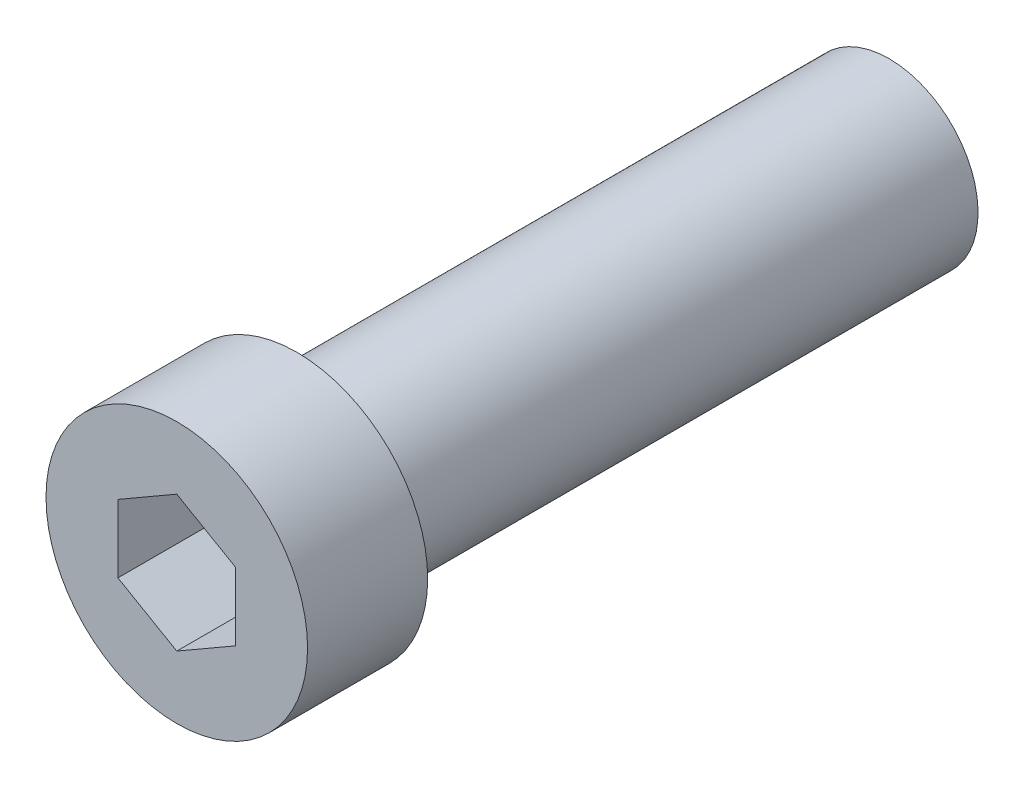
ISO-10303-21;
HEADER;
FILE_DESCRIPTION(('STEP AP214'),'2;1');
FILE_NAME('part.step','',(''),(''),'','','');
FILE_SCHEMA(('AUTOMOTIVE_DESIGN { 1 0 10303 214 1 1 1 1 }'));
ENDSEC;
DATA;
#1=APPLICATION_CONTEXT('core data for automotive mechanical design processes');
#2=APPLICATION_PROTOCOL_DEFINITION('international standard','automotive_design',2000,#1);
#3=PRODUCT_CONTEXT('',#1,'mechanical');
#4=PRODUCT('Part','Part','',(#3));
#5=PRODUCT_RELATED_PRODUCT_CATEGORY('part','',(#4));
#6=PRODUCT_DEFINITION_FORMATION('','',#4);
#7=PRODUCT_DEFINITION_CONTEXT('part definition',#1,'design');
#8=PRODUCT_DEFINITION('design','',#6,#7);
#9=PRODUCT_DEFINITION_SHAPE('','',#8);
#10=(LENGTH_UNIT() NAMED_UNIT(*) SI_UNIT(.MILLI.,.METRE.));
#11=(NAMED_UNIT(*) PLANE_ANGLE_UNIT() SI_UNIT($,.RADIAN.));
#12=(NAMED_UNIT(*) SI_UNIT($,.STERADIAN.) SOLID_ANGLE_UNIT());
#13=UNCERTAINTY_MEASURE_WITH_UNIT(LENGTH_MEASURE(1.E-05),#10,'distance_accuracy_value','');
#14=(GEOMETRIC_REPRESENTATION_CONTEXT(3) GLOBAL_UNCERTAINTY_ASSIGNED_CONTEXT((#13)) GLOBAL_UNIT_ASSIGNED_CONTEXT((#10,
#11,#12)) REPRESENTATION_CONTEXT('',''));
#15=CARTESIAN_POINT('',(0.,0.,0.));
#16=DIRECTION('',(0.,0.,1.));
#17=DIRECTION('',(1.,0.,0.));
#18=AXIS2_PLACEMENT_3D('',#15,#16,#17);
#19=CARTESIAN_POINT('',(0.,0.,2.028));
#20=DIRECTION('',(0.,0.,-1.));
#21=DIRECTION('',(0.,1.,0.));
#22=AXIS2_PLACEMENT_3D('',#19,#20,#21);
#23=CYLINDRICAL_SURFACE('',#22,2.208);
#24=CARTESIAN_POINT('',(0.,0.,2.028));
#25=DIRECTION('',(0.,0.,-1.));
#26=DIRECTION('',(0.,1.,0.));
#27=AXIS2_PLACEMENT_3D('',#24,#25,#26);
#28=CIRCLE('',#27,2.208);
#29=CARTESIAN_POINT('',(0.,2.208,2.028));
#30=VERTEX_POINT('',#29);
#31=EDGE_CURVE('E40',#30,#30,#28,.T.);
#32=ORIENTED_EDGE('',*,*,#31,.T.);
#33=EDGE_LOOP('',(#32));
#34=FACE_BOUND('',#33,.T.);
#35=CARTESIAN_POINT('',(0.,0.,0.));
#36=DIRECTION('',(0.,0.,-1.));
#37=DIRECTION('',(0.,1.,0.));
#38=AXIS2_PLACEMENT_3D('',#35,#36,#37);
#39=CIRCLE('',#38,2.208);
#40=CARTESIAN_POINT('',(0.,2.208,0.));
#41=VERTEX_POINT('',#40);
#42=EDGE_CURVE('E146',#41,#41,#39,.T.);
#43=ORIENTED_EDGE('',*,*,#42,.F.);
#44=EDGE_LOOP('',(#43));
#45=FACE_BOUND('',#44,.T.);
#46=ADVANCED_FACE('F37',(#34,#45),#23,.T.);
#47=CARTESIAN_POINT('',(2.208,0.,2.028));
#48=DIRECTION('',(0.,0.,1.));
#49=DIRECTION('',(0.,-1.,0.));
#50=AXIS2_PLACEMENT_3D('',#47,#48,#49);
#51=PLANE('',#50);
#52=DIRECTION('',(0.866025403784439,0.5,0.));
#53=VECTOR('',#52,1.);
#54=CARTESIAN_POINT('',(0.,-1.14731045493362,2.028));
#55=LINE('',#54,#53);
#56=CARTESIAN_POINT('',(0.,-1.14731045493362,2.028));
#57=VERTEX_POINT('',#56);
#58=CARTESIAN_POINT('',(0.9936,-0.573655227466812,2.028));
#59=VERTEX_POINT('',#58);
#60=EDGE_CURVE('E52',#57,#59,#55,.T.);
#61=ORIENTED_EDGE('',*,*,#60,.F.);
#62=DIRECTION('',(0.866025403784439,-0.5,0.));
#63=VECTOR('',#62,1.);
#64=CARTESIAN_POINT('',(-0.9936,-0.573655227466812,2.028));
#65=LINE('',#64,#63);
#66=CARTESIAN_POINT('',(-0.9936,-0.573655227466812,2.028));
#67=VERTEX_POINT('',#66);
#68=EDGE_CURVE('E135',#67,#57,#65,.T.);
#69=ORIENTED_EDGE('',*,*,#68,.F.);
#70=DIRECTION('',(0.,-1.,0.));
#71=VECTOR('',#70,1.);
#72=CARTESIAN_POINT('',(-0.9936,0.573655227466811,2.028));
#73=LINE('',#72,#71);
#74=CARTESIAN_POINT('',(-0.9936,0.573655227466811,2.028));
#75=VERTEX_POINT('',#74);
#76=EDGE_CURVE('E133',#75,#67,#73,.T.);
#77=ORIENTED_EDGE('',*,*,#76,.F.);
#78=DIRECTION('',(-0.866025403784438,-0.500000000000001,0.));
#79=VECTOR('',#78,1.);
#80=CARTESIAN_POINT('',(0.,1.14731045493362,2.028));
#81=LINE('',#80,#79);
#82=CARTESIAN_POINT('',(0.,1.14731045493362,2.028));
#83=VERTEX_POINT('',#82);
#84=EDGE_CURVE('E100',#83,#75,#81,.T.);
#85=ORIENTED_EDGE('',*,*,#84,.F.);
#86=DIRECTION('',(-0.866025403784438,0.500000000000001,0.));
#87=VECTOR('',#86,1.);
#88=CARTESIAN_POINT('',(0.9936,0.573655227466811,2.028));
#89=LINE('',#88,#87);
#90=CARTESIAN_POINT('',(0.9936,0.573655227466811,2.028));
#91=VERTEX_POINT('',#90);
#92=EDGE_CURVE('E129',#91,#83,#89,.T.);
#93=ORIENTED_EDGE('',*,*,#92,.F.);
#94=DIRECTION('',(0.,1.,0.));
#95=VECTOR('',#94,1.);
#96=CARTESIAN_POINT('',(0.9936,-0.573655227466812,2.028));
#97=LINE('',#96,#95);
#98=EDGE_CURVE('E126',#59,#91,#97,.T.);
#99=ORIENTED_EDGE('',*,*,#98,.F.);
#100=EDGE_LOOP('',(#61,#69,#77,#85,#93,#99));
#101=FACE_BOUND('',#100,.T.);
#102=ORIENTED_EDGE('',*,*,#31,.F.);
#103=EDGE_LOOP('',(#102));
#104=FACE_BOUND('',#103,.T.);
#105=ADVANCED_FACE('F155',(#101,#104),#51,.T.);
#106=CARTESIAN_POINT('',(0.,0.,0.));
#107=DIRECTION('',(0.,0.,-1.));
#108=DIRECTION('',(0.,1.,0.));
#109=AXIS2_PLACEMENT_3D('',#106,#107,#108);
#110=PLANE('',#109);
#111=CARTESIAN_POINT('',(0.,0.,0.));
#112=DIRECTION('',(0.,0.,-1.));
#113=DIRECTION('',(0.,1.,0.));
#114=AXIS2_PLACEMENT_3D('',#111,#112,#113);
#115=CIRCLE('',#114,1.50000000000006);
#116=CARTESIAN_POINT('',(0.,1.50000000000006,0.));
#117=VERTEX_POINT('',#116);
#118=EDGE_CURVE('E11',#117,#117,#115,.T.);
#119=ORIENTED_EDGE('',*,*,#118,.F.);
#120=EDGE_LOOP('',(#119));
#121=FACE_BOUND('',#120,.T.);
#122=ORIENTED_EDGE('',*,*,#42,.T.);
#123=EDGE_LOOP('',(#122));
#124=FACE_BOUND('',#123,.T.);
#125=ADVANCED_FACE('F157',(#121,#124),#110,.T.);
#126=CARTESIAN_POINT('',(0.,0.,-10.));
#127=DIRECTION('',(0.,0.,1.));
#128=DIRECTION('',(0.,-1.,0.));
#129=AXIS2_PLACEMENT_3D('',#126,#127,#128);
#130=CYLINDRICAL_SURFACE('',#129,1.50000000000006);
#131=CARTESIAN_POINT('',(0.,0.,-10.));
#132=DIRECTION('',(0.,0.,-1.));
#133=DIRECTION('',(0.,1.,0.));
#134=AXIS2_PLACEMENT_3D('',#131,#132,#133);
#135=CIRCLE('',#134,1.50000000000006);
#136=CARTESIAN_POINT('',(0.,1.50000000000005,-10.));
#137=VERTEX_POINT('',#136);
#138=EDGE_CURVE('E139',#137,#137,#135,.T.);
#139=ORIENTED_EDGE('',*,*,#138,.F.);
#140=EDGE_LOOP('',(#139));
#141=FACE_BOUND('',#140,.T.);
#142=ORIENTED_EDGE('',*,*,#118,.T.);
#143=EDGE_LOOP('',(#142));
#144=FACE_BOUND('',#143,.T.);
#145=ADVANCED_FACE('F163',(#141,#144),#130,.T.);
#146=CARTESIAN_POINT('',(0.,0.,-10.));
#147=DIRECTION('',(0.,0.,-1.));
#148=DIRECTION('',(0.,1.,0.));
#149=AXIS2_PLACEMENT_3D('',#146,#147,#148);
#150=PLANE('',#149);
#151=ORIENTED_EDGE('',*,*,#138,.T.);
#152=EDGE_LOOP('',(#151));
#153=FACE_BOUND('',#152,.T.);
#154=ADVANCED_FACE('F169',(#153),#150,.T.);
#155=CARTESIAN_POINT('',(0.,-1.14731045493362,0.156));
#156=DIRECTION('',(0.5,-0.866025403784439,0.));
#157=DIRECTION('',(0.866025403784439,0.5,0.));
#158=AXIS2_PLACEMENT_3D('',#155,#156,#157);
#159=PLANE('',#158);
#160=ORIENTED_EDGE('',*,*,#60,.T.);
#161=DIRECTION('',(0.,0.,1.));
#162=VECTOR('',#161,1.);
#163=CARTESIAN_POINT('',(0.9936,-0.573655227466812,0.156));
#164=LINE('',#163,#162);
#165=CARTESIAN_POINT('',(0.9936,-0.573655227466812,0.156));
#166=VERTEX_POINT('',#165);
#167=EDGE_CURVE('E82',#166,#59,#164,.T.);
#168=ORIENTED_EDGE('',*,*,#167,.F.);
#169=DIRECTION('',(0.866025403784439,0.5,0.));
#170=VECTOR('',#169,1.);
#171=CARTESIAN_POINT('',(0.,-1.14731045493362,0.156));
#172=LINE('',#171,#170);
#173=CARTESIAN_POINT('',(0.,-1.14731045493362,0.156));
#174=VERTEX_POINT('',#173);
#175=EDGE_CURVE('E137',#174,#166,#172,.T.);
#176=ORIENTED_EDGE('',*,*,#175,.F.);
#177=DIRECTION('',(0.,0.,1.));
#178=VECTOR('',#177,1.);
#179=CARTESIAN_POINT('',(0.,-1.14731045493362,0.156));
#180=LINE('',#179,#178);
#181=EDGE_CURVE('E60',#174,#57,#180,.T.);
#182=ORIENTED_EDGE('',*,*,#181,.T.);
#183=EDGE_LOOP('',(#160,#168,#176,#182));
#184=FACE_BOUND('',#183,.T.);
#185=ADVANCED_FACE('F173',(#184),#159,.F.);
#186=CARTESIAN_POINT('',(-0.9936,-0.573655227466812,0.156));
#187=DIRECTION('',(-0.5,-0.866025403784439,0.));
#188=DIRECTION('',(0.866025403784439,-0.5,0.));
#189=AXIS2_PLACEMENT_3D('',#186,#187,#188);
#190=PLANE('',#189);
#191=ORIENTED_EDGE('',*,*,#68,.T.);
#192=ORIENTED_EDGE('',*,*,#181,.F.);
#193=DIRECTION('',(0.866025403784439,-0.5,0.));
#194=VECTOR('',#193,1.);
#195=CARTESIAN_POINT('',(-0.9936,-0.573655227466812,0.156));
#196=LINE('',#195,#194);
#197=CARTESIAN_POINT('',(-0.9936,-0.573655227466812,0.156));
#198=VERTEX_POINT('',#197);
#199=EDGE_CURVE('E112',#198,#174,#196,.T.);
#200=ORIENTED_EDGE('',*,*,#199,.F.);
#201=DIRECTION('',(0.,0.,1.));
#202=VECTOR('',#201,1.);
#203=CARTESIAN_POINT('',(-0.9936,-0.573655227466812,0.156));
#204=LINE('',#203,#202);
#205=EDGE_CURVE('E104',#198,#67,#204,.T.);
#206=ORIENTED_EDGE('',*,*,#205,.T.);
#207=EDGE_LOOP('',(#191,#192,#200,#206));
#208=FACE_BOUND('',#207,.T.);
#209=ADVANCED_FACE('F177',(#208),#190,.F.);
#210=CARTESIAN_POINT('',(-0.9936,0.573655227466811,0.156));
#211=DIRECTION('',(-1.,0.,0.));
#212=DIRECTION('',(0.,0.,1.));
#213=AXIS2_PLACEMENT_3D('',#210,#211,#212);
#214=PLANE('',#213);
#215=ORIENTED_EDGE('',*,*,#76,.T.);
#216=ORIENTED_EDGE('',*,*,#205,.F.);
#217=DIRECTION('',(0.,-1.,0.));
#218=VECTOR('',#217,1.);
#219=CARTESIAN_POINT('',(-0.9936,0.573655227466811,0.156));
#220=LINE('',#219,#218);
#221=CARTESIAN_POINT('',(-0.9936,0.573655227466811,0.156));
#222=VERTEX_POINT('',#221);
#223=EDGE_CURVE('E108',#222,#198,#220,.T.);
#224=ORIENTED_EDGE('',*,*,#223,.F.);
#225=DIRECTION('',(0.,0.,1.));
#226=VECTOR('',#225,1.);
#227=CARTESIAN_POINT('',(-0.9936,0.573655227466811,0.156));
#228=LINE('',#227,#226);
#229=EDGE_CURVE('E93',#222,#75,#228,.T.);
#230=ORIENTED_EDGE('',*,*,#229,.T.);
#231=EDGE_LOOP('',(#215,#216,#224,#230));
#232=FACE_BOUND('',#231,.T.);
#233=ADVANCED_FACE('F109',(#232),#214,.F.);
#234=CARTESIAN_POINT('',(0.,1.14731045493362,0.156));
#235=DIRECTION('',(-0.500000000000001,0.866025403784438,0.));
#236=DIRECTION('',(-0.866025403784438,-0.500000000000001,0.));
#237=AXIS2_PLACEMENT_3D('',#234,#235,#236);
#238=PLANE('',#237);
#239=ORIENTED_EDGE('',*,*,#84,.T.);
#240=ORIENTED_EDGE('',*,*,#229,.F.);
#241=DIRECTION('',(-0.866025403784438,-0.500000000000001,0.));
#242=VECTOR('',#241,1.);
#243=CARTESIAN_POINT('',(0.,1.14731045493362,0.156));
#244=LINE('',#243,#242);
#245=CARTESIAN_POINT('',(0.,1.14731045493362,0.156));
#246=VERTEX_POINT('',#245);
#247=EDGE_CURVE('E97',#246,#222,#244,.T.);
#248=ORIENTED_EDGE('',*,*,#247,.F.);
#249=DIRECTION('',(0.,0.,1.));
#250=VECTOR('',#249,1.);
#251=CARTESIAN_POINT('',(0.,1.14731045493362,0.156));
#252=LINE('',#251,#250);
#253=EDGE_CURVE('E105',#246,#83,#252,.T.);
#254=ORIENTED_EDGE('',*,*,#253,.T.);
#255=EDGE_LOOP('',(#239,#240,#248,#254));
#256=FACE_BOUND('',#255,.T.);
#257=ADVANCED_FACE('F95',(#256),#238,.F.);
#258=CARTESIAN_POINT('',(0.9936,0.573655227466811,0.156));
#259=DIRECTION('',(0.500000000000001,0.866025403784438,0.));
#260=DIRECTION('',(-0.866025403784438,0.500000000000001,0.));
#261=AXIS2_PLACEMENT_3D('',#258,#259,#260);
#262=PLANE('',#261);
#263=ORIENTED_EDGE('',*,*,#92,.T.);
#264=ORIENTED_EDGE('',*,*,#253,.F.);
#265=DIRECTION('',(-0.866025403784438,0.500000000000001,0.));
#266=VECTOR('',#265,1.);
#267=CARTESIAN_POINT('',(0.9936,0.573655227466811,0.156));
#268=LINE('',#267,#266);
#269=CARTESIAN_POINT('',(0.9936,0.573655227466811,0.156));
#270=VERTEX_POINT('',#269);
#271=EDGE_CURVE('E118',#270,#246,#268,.T.);
#272=ORIENTED_EDGE('',*,*,#271,.F.);
#273=DIRECTION('',(0.,0.,1.));
#274=VECTOR('',#273,1.);
#275=CARTESIAN_POINT('',(0.9936,0.573655227466811,0.156));
#276=LINE('',#275,#274);
#277=EDGE_CURVE('E142',#270,#91,#276,.T.);
#278=ORIENTED_EDGE('',*,*,#277,.T.);
#279=EDGE_LOOP('',(#263,#264,#272,#278));
#280=FACE_BOUND('',#279,.T.);
#281=ADVANCED_FACE('F181',(#280),#262,.F.);
#282=CARTESIAN_POINT('',(0.9936,-0.573655227466812,0.156));
#283=DIRECTION('',(1.,0.,0.));
#284=DIRECTION('',(0.,0.,-1.));
#285=AXIS2_PLACEMENT_3D('',#282,#283,#284);
#286=PLANE('',#285);
#287=ORIENTED_EDGE('',*,*,#98,.T.);
#288=ORIENTED_EDGE('',*,*,#277,.F.);
#289=DIRECTION('',(0.,1.,0.));
#290=VECTOR('',#289,1.);
#291=CARTESIAN_POINT('',(0.9936,-0.573655227466812,0.156));
#292=LINE('',#291,#290);
#293=EDGE_CURVE('E120',#166,#270,#292,.T.);
#294=ORIENTED_EDGE('',*,*,#293,.F.);
#295=ORIENTED_EDGE('',*,*,#167,.T.);
#296=EDGE_LOOP('',(#287,#288,#294,#295));
#297=FACE_BOUND('',#296,.T.);
#298=ADVANCED_FACE('F178',(#297),#286,.F.);
#299=CARTESIAN_POINT('',(0.,0.,0.156));
#300=DIRECTION('',(0.,0.,1.));
#301=DIRECTION('',(1.,0.,0.));
#302=AXIS2_PLACEMENT_3D('',#299,#300,#301);
#303=PLANE('',#302);
#304=ORIENTED_EDGE('',*,*,#175,.T.);
#305=ORIENTED_EDGE('',*,*,#293,.T.);
#306=ORIENTED_EDGE('',*,*,#271,.T.);
#307=ORIENTED_EDGE('',*,*,#247,.T.);
#308=ORIENTED_EDGE('',*,*,#223,.T.);
#309=ORIENTED_EDGE('',*,*,#199,.T.);
#310=EDGE_LOOP('',(#304,#305,#306,#307,#308,#309));
#311=FACE_BOUND('',#310,.T.);
#312=ADVANCED_FACE('F115',(#311),#303,.T.);
#313=CLOSED_SHELL('',(#46,#105,#125,#145,#154,#185,#209,#233,#257,#281,#298,#312));
#314=MANIFOLD_SOLID_BREP('B2',#313);
#315=ADVANCED_BREP_SHAPE_REPRESENTATION('',(#18,#314),#14);
#316=SHAPE_DEFINITION_REPRESENTATION(#9,#315);
ENDSEC;
END-ISO-10303-21;
